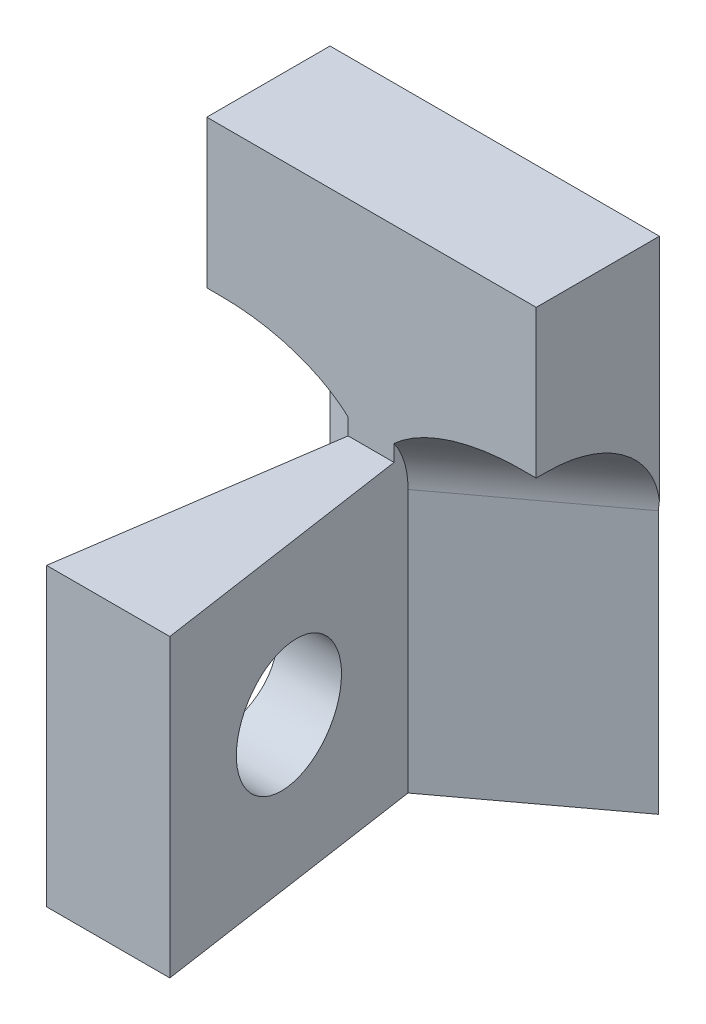
ISO-10303-21;
HEADER;
FILE_DESCRIPTION(('STEP AP214'),'2;1');
FILE_NAME('part.step','',(''),(''),'','','');
FILE_SCHEMA(('AUTOMOTIVE_DESIGN { 1 0 10303 214 1 1 1 1 }'));
ENDSEC;
DATA;
#1=APPLICATION_CONTEXT('core data for automotive mechanical design processes');
#2=APPLICATION_PROTOCOL_DEFINITION('international standard','automotive_design',2000,#1);
#3=PRODUCT_CONTEXT('',#1,'mechanical');
#4=PRODUCT('Part','Part','',(#3));
#5=PRODUCT_RELATED_PRODUCT_CATEGORY('part','',(#4));
#6=PRODUCT_DEFINITION_FORMATION('','',#4);
#7=PRODUCT_DEFINITION_CONTEXT('part definition',#1,'design');
#8=PRODUCT_DEFINITION('design','',#6,#7);
#9=PRODUCT_DEFINITION_SHAPE('','',#8);
#10=(LENGTH_UNIT() NAMED_UNIT(*) SI_UNIT(.MILLI.,.METRE.));
#11=(NAMED_UNIT(*) PLANE_ANGLE_UNIT() SI_UNIT($,.RADIAN.));
#12=(NAMED_UNIT(*) SI_UNIT($,.STERADIAN.) SOLID_ANGLE_UNIT());
#13=UNCERTAINTY_MEASURE_WITH_UNIT(LENGTH_MEASURE(1.E-05),#10,'distance_accuracy_value','');
#14=(GEOMETRIC_REPRESENTATION_CONTEXT(3) GLOBAL_UNCERTAINTY_ASSIGNED_CONTEXT((#13)) GLOBAL_UNIT_ASSIGNED_CONTEXT((#10,
#11,#12)) REPRESENTATION_CONTEXT('',''));
#15=CARTESIAN_POINT('',(0.,0.,0.));
#16=DIRECTION('',(0.,0.,1.));
#17=DIRECTION('',(1.,0.,0.));
#18=AXIS2_PLACEMENT_3D('',#15,#16,#17);
#19=CARTESIAN_POINT('',(19.4117647058824,36.,-47.));
#20=DIRECTION('',(0.,-1.,0.));
#21=DIRECTION('',(0.,0.,-1.));
#22=AXIS2_PLACEMENT_3D('',#19,#20,#21);
#23=PLANE('',#22);
#24=DIRECTION('',(1.,0.,0.));
#25=VECTOR('',#24,1.);
#26=CARTESIAN_POINT('',(22.7941176470588,36.,-32.));
#27=LINE('',#26,#25);
#28=CARTESIAN_POINT('',(17.2058823529412,36.,-32.));
#29=VERTEX_POINT('',#28);
#30=CARTESIAN_POINT('',(22.7941176470588,36.,-32.));
#31=VERTEX_POINT('',#30);
#32=EDGE_CURVE('E153',#29,#31,#27,.T.);
#33=ORIENTED_EDGE('',*,*,#32,.F.);
#34=DIRECTION('',(-0.145493990494831,0.,0.989359135364853));
#35=VECTOR('',#34,1.);
#36=CARTESIAN_POINT('',(12.5,36.,0.));
#37=LINE('',#36,#35);
#38=CARTESIAN_POINT('',(12.5,36.,0.));
#39=VERTEX_POINT('',#38);
#40=EDGE_CURVE('E221',#29,#39,#37,.T.);
#41=ORIENTED_EDGE('',*,*,#40,.T.);
#42=DIRECTION('',(1.,0.,0.));
#43=VECTOR('',#42,1.);
#44=CARTESIAN_POINT('',(27.5,36.,0.));
#45=LINE('',#44,#43);
#46=CARTESIAN_POINT('',(27.5,36.,0.));
#47=VERTEX_POINT('',#46);
#48=EDGE_CURVE('E244',#39,#47,#45,.T.);
#49=ORIENTED_EDGE('',*,*,#48,.T.);
#50=DIRECTION('',(-0.145493990494831,0.,-0.989359135364853));
#51=VECTOR('',#50,1.);
#52=CARTESIAN_POINT('',(27.5,36.,0.));
#53=LINE('',#52,#51);
#54=EDGE_CURVE('E185',#47,#31,#53,.T.);
#55=ORIENTED_EDGE('',*,*,#54,.T.);
#56=EDGE_LOOP('',(#33,#41,#49,#55));
#57=FACE_BOUND('',#56,.T.);
#58=ADVANCED_FACE('F34',(#57),#23,.F.);
#59=CARTESIAN_POINT('',(12.5,36.,0.));
#60=DIRECTION('',(0.989359135364853,0.,0.145493990494831));
#61=DIRECTION('',(0.145493990494831,0.,-0.989359135364853));
#62=AXIS2_PLACEMENT_3D('',#59,#60,#61);
#63=PLANE('',#62);
#64=DIRECTION('',(0.,-1.,0.));
#65=VECTOR('',#64,1.);
#66=CARTESIAN_POINT('',(17.2058823529412,43.,-32.));
#67=LINE('',#66,#65);
#68=CARTESIAN_POINT('',(17.2058823529412,38.0006477236576,-32.));
#69=VERTEX_POINT('',#68);
#70=EDGE_CURVE('E190',#69,#29,#67,.T.);
#71=ORIENTED_EDGE('',*,*,#70,.F.);
#72=CARTESIAN_POINT('',(15.683314220284,32.,-21.6465366979314));
#73=DIRECTION('',(0.989359135364853,0.,0.145493990494831));
#74=DIRECTION('',(0.145493990494831,0.,-0.989359135364853));
#75=AXIS2_PLACEMENT_3D('',#72,#73,#74);
#76=ELLIPSE('',#75,12.4863286348621,11.);
#77=CARTESIAN_POINT('',(17.5,32.,-34.));
#78=VERTEX_POINT('',#77);
#79=EDGE_CURVE('E199',#69,#78,#76,.F.);
#80=ORIENTED_EDGE('',*,*,#79,.T.);
#81=DIRECTION('',(0.,-1.,0.));
#82=VECTOR('',#81,1.);
#83=CARTESIAN_POINT('',(17.5,36.,-34.));
#84=LINE('',#83,#82);
#85=CARTESIAN_POINT('',(17.5,0.,-34.));
#86=VERTEX_POINT('',#85);
#87=EDGE_CURVE('E229',#78,#86,#84,.T.);
#88=ORIENTED_EDGE('',*,*,#87,.T.);
#89=DIRECTION('',(-0.145493990494831,0.,0.989359135364853));
#90=VECTOR('',#89,1.);
#91=CARTESIAN_POINT('',(12.5,0.,0.));
#92=LINE('',#91,#90);
#93=CARTESIAN_POINT('',(12.5,0.,0.));
#94=VERTEX_POINT('',#93);
#95=EDGE_CURVE('E254',#86,#94,#92,.T.);
#96=ORIENTED_EDGE('',*,*,#95,.T.);
#97=DIRECTION('',(0.,-1.,0.));
#98=VECTOR('',#97,1.);
#99=CARTESIAN_POINT('',(12.5,36.,0.));
#100=LINE('',#99,#98);
#101=EDGE_CURVE('E236',#39,#94,#100,.T.);
#102=ORIENTED_EDGE('',*,*,#101,.F.);
#103=ORIENTED_EDGE('',*,*,#40,.F.);
#104=EDGE_LOOP('',(#71,#80,#88,#96,#102,#103));
#105=FACE_BOUND('',#104,.T.);
#106=CARTESIAN_POINT('',(15.,18.,-17.));
#107=DIRECTION('',(0.989359135364853,0.,0.145493990494831));
#108=DIRECTION('',(-0.145493990494831,0.,0.989359135364853));
#109=AXIS2_PLACEMENT_3D('',#106,#107,#108);
#110=ELLIPSE('',#109,7.58066482828217,7.5);
#111=CARTESIAN_POINT('',(13.8970588235294,18.,-9.50000000000001));
#112=VERTEX_POINT('',#111);
#113=EDGE_CURVE('E242',#112,#112,#110,.F.);
#114=ORIENTED_EDGE('',*,*,#113,.F.);
#115=EDGE_LOOP('',(#114));
#116=FACE_BOUND('',#115,.T.);
#117=ADVANCED_FACE('F217',(#105,#116),#63,.F.);
#118=CARTESIAN_POINT('',(27.5,36.,0.));
#119=DIRECTION('',(-0.989359135364853,0.,0.145493990494831));
#120=DIRECTION('',(0.145493990494831,0.,0.989359135364853));
#121=AXIS2_PLACEMENT_3D('',#118,#119,#120);
#122=PLANE('',#121);
#123=DIRECTION('',(0.,-1.,0.));
#124=VECTOR('',#123,1.);
#125=CARTESIAN_POINT('',(22.5,36.,-34.));
#126=LINE('',#125,#124);
#127=CARTESIAN_POINT('',(22.5,32.,-34.));
#128=VERTEX_POINT('',#127);
#129=CARTESIAN_POINT('',(22.5,0.,-34.));
#130=VERTEX_POINT('',#129);
#131=EDGE_CURVE('E184',#128,#130,#126,.T.);
#132=ORIENTED_EDGE('',*,*,#131,.F.);
#133=CARTESIAN_POINT('',(24.316685779716,32.,-21.6465366979314));
#134=DIRECTION('',(-0.989359135364853,0.,0.145493990494831));
#135=DIRECTION('',(0.145493990494831,0.,0.989359135364853));
#136=AXIS2_PLACEMENT_3D('',#133,#134,#135);
#137=ELLIPSE('',#136,12.4863286348621,11.);
#138=CARTESIAN_POINT('',(22.7941176470588,38.0006477236576,-32.));
#139=VERTEX_POINT('',#138);
#140=EDGE_CURVE('E187',#128,#139,#137,.F.);
#141=ORIENTED_EDGE('',*,*,#140,.T.);
#142=DIRECTION('',(0.,-1.,0.));
#143=VECTOR('',#142,1.);
#144=CARTESIAN_POINT('',(22.7941176470588,43.,-32.));
#145=LINE('',#144,#143);
#146=EDGE_CURVE('E155',#139,#31,#145,.T.);
#147=ORIENTED_EDGE('',*,*,#146,.T.);
#148=ORIENTED_EDGE('',*,*,#54,.F.);
#149=DIRECTION('',(0.,-1.,0.));
#150=VECTOR('',#149,1.);
#151=CARTESIAN_POINT('',(27.5,36.,0.));
#152=LINE('',#151,#150);
#153=CARTESIAN_POINT('',(27.5,0.,0.));
#154=VERTEX_POINT('',#153);
#155=EDGE_CURVE('E264',#47,#154,#152,.T.);
#156=ORIENTED_EDGE('',*,*,#155,.T.);
#157=DIRECTION('',(-0.145493990494831,0.,-0.989359135364853));
#158=VECTOR('',#157,1.);
#159=CARTESIAN_POINT('',(27.5,0.,0.));
#160=LINE('',#159,#158);
#161=EDGE_CURVE('E258',#154,#130,#160,.T.);
#162=ORIENTED_EDGE('',*,*,#161,.T.);
#163=EDGE_LOOP('',(#132,#141,#147,#148,#156,#162));
#164=FACE_BOUND('',#163,.T.);
#165=CARTESIAN_POINT('',(25.,18.,-17.));
#166=DIRECTION('',(-0.989359135364853,0.,0.145493990494831));
#167=DIRECTION('',(-0.145493990494831,0.,-0.989359135364853));
#168=AXIS2_PLACEMENT_3D('',#165,#166,#167);
#169=ELLIPSE('',#168,7.58066482828217,7.5);
#170=CARTESIAN_POINT('',(23.8970588235294,18.,-24.5));
#171=VERTEX_POINT('',#170);
#172=EDGE_CURVE('E197',#171,#171,#169,.F.);
#173=ORIENTED_EDGE('',*,*,#172,.F.);
#174=EDGE_LOOP('',(#173));
#175=FACE_BOUND('',#174,.T.);
#176=ADVANCED_FACE('F279',(#164,#175),#122,.F.);
#177=CARTESIAN_POINT('',(40.,36.,-47.));
#178=DIRECTION('',(0.,0.,1.));
#179=DIRECTION('',(1.,0.,0.));
#180=AXIS2_PLACEMENT_3D('',#177,#178,#179);
#181=PLANE('',#180);
#182=DIRECTION('',(-1.,0.,0.));
#183=VECTOR('',#182,1.);
#184=CARTESIAN_POINT('',(40.,0.,-47.));
#185=LINE('',#184,#183);
#186=CARTESIAN_POINT('',(40.,0.,-47.));
#187=VERTEX_POINT('',#186);
#188=CARTESIAN_POINT('',(0.,0.,-47.));
#189=VERTEX_POINT('',#188);
#190=EDGE_CURVE('E234',#187,#189,#185,.T.);
#191=ORIENTED_EDGE('',*,*,#190,.T.);
#192=DIRECTION('',(0.,-1.,0.));
#193=VECTOR('',#192,1.);
#194=CARTESIAN_POINT('',(0.,36.,-47.));
#195=LINE('',#194,#193);
#196=CARTESIAN_POINT('',(0.,32.,-47.));
#197=VERTEX_POINT('',#196);
#198=EDGE_CURVE('E181',#197,#189,#195,.T.);
#199=ORIENTED_EDGE('',*,*,#198,.F.);
#200=DIRECTION('',(0.,-1.,0.));
#201=VECTOR('',#200,1.);
#202=CARTESIAN_POINT('',(0.,61.,-47.));
#203=LINE('',#202,#201);
#204=CARTESIAN_POINT('',(0.,61.,-47.));
#205=VERTEX_POINT('',#204);
#206=EDGE_CURVE('E232',#205,#197,#203,.T.);
#207=ORIENTED_EDGE('',*,*,#206,.F.);
#208=DIRECTION('',(-1.,0.,0.));
#209=VECTOR('',#208,1.);
#210=CARTESIAN_POINT('',(0.,61.,-47.));
#211=LINE('',#210,#209);
#212=CARTESIAN_POINT('',(40.0985604754172,61.,-47.));
#213=VERTEX_POINT('',#212);
#214=EDGE_CURVE('E144',#213,#205,#211,.T.);
#215=ORIENTED_EDGE('',*,*,#214,.F.);
#216=DIRECTION('',(0.,-1.,0.));
#217=VECTOR('',#216,1.);
#218=CARTESIAN_POINT('',(40.0985604754172,61.,-47.));
#219=LINE('',#218,#217);
#220=CARTESIAN_POINT('',(40.0985604754172,33.1355937280815,-47.));
#221=VERTEX_POINT('',#220);
#222=EDGE_CURVE('E49',#213,#221,#219,.T.);
#223=ORIENTED_EDGE('',*,*,#222,.T.);
#224=CARTESIAN_POINT('',(58.446347917116,32.,-47.));
#225=DIRECTION('',(0.,0.,1.));
#226=DIRECTION('',(-1.,0.,0.));
#227=AXIS2_PLACEMENT_3D('',#224,#225,#226);
#228=ELLIPSE('',#227,18.446347917116,11.);
#229=CARTESIAN_POINT('',(40.,32.,-47.));
#230=VERTEX_POINT('',#229);
#231=EDGE_CURVE('E206',#221,#230,#228,.T.);
#232=ORIENTED_EDGE('',*,*,#231,.T.);
#233=DIRECTION('',(0.,-1.,0.));
#234=VECTOR('',#233,1.);
#235=CARTESIAN_POINT('',(40.,36.,-47.));
#236=LINE('',#235,#234);
#237=EDGE_CURVE('E182',#230,#187,#236,.T.);
#238=ORIENTED_EDGE('',*,*,#237,.T.);
#239=EDGE_LOOP('',(#191,#199,#207,#215,#223,#232,#238));
#240=FACE_BOUND('',#239,.T.);
#241=ADVANCED_FACE('F231',(#240),#181,.F.);
#242=CARTESIAN_POINT('',(0.,36.,-47.));
#243=DIRECTION('',(0.596324001337593,0.,-0.802743847954453));
#244=DIRECTION('',(-0.802743847954453,0.,-0.596324001337593));
#245=AXIS2_PLACEMENT_3D('',#242,#243,#244);
#246=PLANE('',#245);
#247=ORIENTED_EDGE('',*,*,#87,.F.);
#248=DIRECTION('',(0.802743847954453,0.,0.596324001337593));
#249=VECTOR('',#248,1.);
#250=CARTESIAN_POINT('',(0.,32.,-47.));
#251=LINE('',#250,#249);
#252=EDGE_CURVE('E201',#78,#197,#251,.F.);
#253=ORIENTED_EDGE('',*,*,#252,.T.);
#254=ORIENTED_EDGE('',*,*,#198,.T.);
#255=DIRECTION('',(0.802743847954453,0.,0.596324001337593));
#256=VECTOR('',#255,1.);
#257=CARTESIAN_POINT('',(0.,0.,-47.));
#258=LINE('',#257,#256);
#259=EDGE_CURVE('E252',#189,#86,#258,.T.);
#260=ORIENTED_EDGE('',*,*,#259,.T.);
#261=EDGE_LOOP('',(#247,#253,#254,#260));
#262=FACE_BOUND('',#261,.T.);
#263=ADVANCED_FACE('F226',(#262),#246,.F.);
#264=CARTESIAN_POINT('',(27.5,36.,0.));
#265=DIRECTION('',(0.,0.,-1.));
#266=DIRECTION('',(-1.,0.,0.));
#267=AXIS2_PLACEMENT_3D('',#264,#265,#266);
#268=PLANE('',#267);
#269=DIRECTION('',(1.,0.,0.));
#270=VECTOR('',#269,1.);
#271=CARTESIAN_POINT('',(27.5,0.,0.));
#272=LINE('',#271,#270);
#273=EDGE_CURVE('E256',#94,#154,#272,.T.);
#274=ORIENTED_EDGE('',*,*,#273,.T.);
#275=ORIENTED_EDGE('',*,*,#155,.F.);
#276=ORIENTED_EDGE('',*,*,#48,.F.);
#277=ORIENTED_EDGE('',*,*,#101,.T.);
#278=EDGE_LOOP('',(#274,#275,#276,#277));
#279=FACE_BOUND('',#278,.T.);
#280=ADVANCED_FACE('F270',(#279),#268,.F.);
#281=CARTESIAN_POINT('',(22.5,36.,-34.));
#282=DIRECTION('',(-0.596324001337593,0.,-0.802743847954453));
#283=DIRECTION('',(-0.802743847954453,0.,0.596324001337593));
#284=AXIS2_PLACEMENT_3D('',#281,#282,#283);
#285=PLANE('',#284);
#286=ORIENTED_EDGE('',*,*,#237,.F.);
#287=DIRECTION('',(0.802743847954453,0.,-0.596324001337593));
#288=VECTOR('',#287,1.);
#289=CARTESIAN_POINT('',(22.5,32.,-34.));
#290=LINE('',#289,#288);
#291=EDGE_CURVE('E180',#230,#128,#290,.F.);
#292=ORIENTED_EDGE('',*,*,#291,.T.);
#293=ORIENTED_EDGE('',*,*,#131,.T.);
#294=DIRECTION('',(0.802743847954453,0.,-0.596324001337593));
#295=VECTOR('',#294,1.);
#296=CARTESIAN_POINT('',(22.5,0.,-34.));
#297=LINE('',#296,#295);
#298=EDGE_CURVE('E245',#130,#187,#297,.T.);
#299=ORIENTED_EDGE('',*,*,#298,.T.);
#300=EDGE_LOOP('',(#286,#292,#293,#299));
#301=FACE_BOUND('',#300,.T.);
#302=ADVANCED_FACE('F322',(#301),#285,.F.);
#303=CARTESIAN_POINT('',(19.4117647058824,0.,-47.));
#304=DIRECTION('',(0.,-1.,0.));
#305=DIRECTION('',(0.,0.,-1.));
#306=AXIS2_PLACEMENT_3D('',#303,#304,#305);
#307=PLANE('',#306);
#308=ORIENTED_EDGE('',*,*,#190,.F.);
#309=ORIENTED_EDGE('',*,*,#298,.F.);
#310=ORIENTED_EDGE('',*,*,#161,.F.);
#311=ORIENTED_EDGE('',*,*,#273,.F.);
#312=ORIENTED_EDGE('',*,*,#95,.F.);
#313=ORIENTED_EDGE('',*,*,#259,.F.);
#314=EDGE_LOOP('',(#308,#309,#310,#311,#312,#313));
#315=FACE_BOUND('',#314,.T.);
#316=ADVANCED_FACE('F275',(#315),#307,.T.);
#317=CARTESIAN_POINT('',(40.,18.,-17.));
#318=DIRECTION('',(-1.,0.,0.));
#319=DIRECTION('',(0.,0.,1.));
#320=AXIS2_PLACEMENT_3D('',#317,#318,#319);
#321=CYLINDRICAL_SURFACE('',#320,7.5);
#322=ORIENTED_EDGE('',*,*,#172,.T.);
#323=EDGE_LOOP('',(#322));
#324=FACE_BOUND('',#323,.T.);
#325=ORIENTED_EDGE('',*,*,#113,.T.);
#326=EDGE_LOOP('',(#325));
#327=FACE_BOUND('',#326,.T.);
#328=ADVANCED_FACE('F308',(#324,#327),#321,.F.);
#329=CARTESIAN_POINT('',(22.7941176470588,43.,-32.));
#330=DIRECTION('',(0.,0.,-1.));
#331=DIRECTION('',(-1.,0.,0.));
#332=AXIS2_PLACEMENT_3D('',#329,#330,#331);
#333=PLANE('',#332);
#334=ORIENTED_EDGE('',*,*,#32,.T.);
#335=ORIENTED_EDGE('',*,*,#146,.F.);
#336=CARTESIAN_POINT('',(38.2540402248083,32.,-32.));
#337=DIRECTION('',(0.,0.,-1.));
#338=DIRECTION('',(-1.,0.,0.));
#339=AXIS2_PLACEMENT_3D('',#336,#337,#338);
#340=ELLIPSE('',#339,18.446347917116,11.);
#341=CARTESIAN_POINT('',(38.2540402248083,43.,-32.));
#342=VERTEX_POINT('',#341);
#343=EDGE_CURVE('E208',#139,#342,#340,.T.);
#344=ORIENTED_EDGE('',*,*,#343,.T.);
#345=DIRECTION('',(1.,0.,0.));
#346=VECTOR('',#345,1.);
#347=CARTESIAN_POINT('',(0.,43.,-32.));
#348=LINE('',#347,#346);
#349=CARTESIAN_POINT('',(40.0985604754172,43.,-32.));
#350=VERTEX_POINT('',#349);
#351=EDGE_CURVE('E163',#342,#350,#348,.T.);
#352=ORIENTED_EDGE('',*,*,#351,.T.);
#353=DIRECTION('',(0.,-1.,0.));
#354=VECTOR('',#353,1.);
#355=CARTESIAN_POINT('',(40.0985604754172,61.,-32.));
#356=LINE('',#355,#354);
#357=CARTESIAN_POINT('',(40.0985604754172,61.,-32.));
#358=VERTEX_POINT('',#357);
#359=EDGE_CURVE('E136',#358,#350,#356,.T.);
#360=ORIENTED_EDGE('',*,*,#359,.F.);
#361=DIRECTION('',(1.,0.,0.));
#362=VECTOR('',#361,1.);
#363=CARTESIAN_POINT('',(0.,61.,-32.));
#364=LINE('',#363,#362);
#365=CARTESIAN_POINT('',(0.,61.,-32.));
#366=VERTEX_POINT('',#365);
#367=EDGE_CURVE('E128',#366,#358,#364,.T.);
#368=ORIENTED_EDGE('',*,*,#367,.F.);
#369=DIRECTION('',(0.,-1.,0.));
#370=VECTOR('',#369,1.);
#371=CARTESIAN_POINT('',(0.,61.,-32.));
#372=LINE('',#371,#370);
#373=CARTESIAN_POINT('',(0.,43.,-32.));
#374=VERTEX_POINT('',#373);
#375=EDGE_CURVE('E134',#366,#374,#372,.T.);
#376=ORIENTED_EDGE('',*,*,#375,.T.);
#377=CARTESIAN_POINT('',(1.7459597751917,43.,-32.));
#378=VERTEX_POINT('',#377);
#379=EDGE_CURVE('E160',#374,#378,#348,.T.);
#380=ORIENTED_EDGE('',*,*,#379,.T.);
#381=CARTESIAN_POINT('',(1.7459597751917,32.,-32.));
#382=DIRECTION('',(0.,0.,-1.));
#383=DIRECTION('',(-1.,0.,0.));
#384=AXIS2_PLACEMENT_3D('',#381,#382,#383);
#385=ELLIPSE('',#384,18.446347917116,11.);
#386=EDGE_CURVE('E43',#378,#69,#385,.T.);
#387=ORIENTED_EDGE('',*,*,#386,.T.);
#388=ORIENTED_EDGE('',*,*,#70,.T.);
#389=EDGE_LOOP('',(#334,#335,#344,#352,#360,#368,#376,#380,#387,#388));
#390=FACE_BOUND('',#389,.T.);
#391=ADVANCED_FACE('F131',(#390),#333,.F.);
#392=CARTESIAN_POINT('',(0.,43.,-32.));
#393=DIRECTION('',(0.,1.,0.));
#394=DIRECTION('',(0.,0.,1.));
#395=AXIS2_PLACEMENT_3D('',#392,#393,#394);
#396=PLANE('',#395);
#397=DIRECTION('',(0.,0.,1.));
#398=VECTOR('',#397,1.);
#399=CARTESIAN_POINT('',(0.,43.,-47.));
#400=LINE('',#399,#398);
#401=CARTESIAN_POINT('',(0.,43.,-33.2969986901424));
#402=VERTEX_POINT('',#401);
#403=EDGE_CURVE('E151',#402,#374,#400,.T.);
#404=ORIENTED_EDGE('',*,*,#403,.F.);
#405=DIRECTION('',(0.802743847954453,0.,0.596324001337593));
#406=VECTOR('',#405,1.);
#407=CARTESIAN_POINT('',(10.9404359852865,43.,-25.169817672501));
#408=LINE('',#407,#406);
#409=EDGE_CURVE('E198',#402,#378,#408,.T.);
#410=ORIENTED_EDGE('',*,*,#409,.T.);
#411=ORIENTED_EDGE('',*,*,#379,.F.);
#412=EDGE_LOOP('',(#404,#410,#411));
#413=FACE_BOUND('',#412,.T.);
#414=ADVANCED_FACE('F301',(#413),#396,.F.);
#415=ORIENTED_EDGE('',*,*,#351,.F.);
#416=DIRECTION('',(0.802743847954453,0.,-0.596324001337593));
#417=VECTOR('',#416,1.);
#418=CARTESIAN_POINT('',(46.5595640147135,43.,-38.169817672501));
#419=LINE('',#418,#417);
#420=CARTESIAN_POINT('',(40.0985604754172,43.,-33.3702150433095));
#421=VERTEX_POINT('',#420);
#422=EDGE_CURVE('E177',#342,#421,#419,.T.);
#423=ORIENTED_EDGE('',*,*,#422,.T.);
#424=DIRECTION('',(0.,0.,-1.));
#425=VECTOR('',#424,1.);
#426=CARTESIAN_POINT('',(40.0985604754172,43.,-47.));
#427=LINE('',#426,#425);
#428=EDGE_CURVE('E147',#350,#421,#427,.T.);
#429=ORIENTED_EDGE('',*,*,#428,.F.);
#430=EDGE_LOOP('',(#415,#423,#429));
#431=FACE_BOUND('',#430,.T.);
#432=ADVANCED_FACE('F296',(#431),#396,.F.);
#433=CARTESIAN_POINT('',(0.,61.,-47.));
#434=DIRECTION('',(1.,0.,0.));
#435=DIRECTION('',(0.,0.,-1.));
#436=AXIS2_PLACEMENT_3D('',#433,#434,#435);
#437=PLANE('',#436);
#438=ORIENTED_EDGE('',*,*,#206,.T.);
#439=CARTESIAN_POINT('',(0.,32.,-33.2969986901424));
#440=DIRECTION('',(1.,0.,0.));
#441=DIRECTION('',(0.,0.,-1.));
#442=AXIS2_PLACEMENT_3D('',#439,#440,#441);
#443=ELLIPSE('',#442,13.7030013098576,11.);
#444=EDGE_CURVE('E11',#197,#402,#443,.T.);
#445=ORIENTED_EDGE('',*,*,#444,.T.);
#446=ORIENTED_EDGE('',*,*,#403,.T.);
#447=ORIENTED_EDGE('',*,*,#375,.F.);
#448=DIRECTION('',(0.,0.,1.));
#449=VECTOR('',#448,1.);
#450=CARTESIAN_POINT('',(0.,61.,-47.));
#451=LINE('',#450,#449);
#452=EDGE_CURVE('E140',#205,#366,#451,.T.);
#453=ORIENTED_EDGE('',*,*,#452,.F.);
#454=EDGE_LOOP('',(#438,#445,#446,#447,#453));
#455=FACE_BOUND('',#454,.T.);
#456=ADVANCED_FACE('F149',(#455),#437,.F.);
#457=CARTESIAN_POINT('',(40.0985604754172,61.,-47.));
#458=DIRECTION('',(-1.,0.,0.));
#459=DIRECTION('',(0.,0.,1.));
#460=AXIS2_PLACEMENT_3D('',#457,#458,#459);
#461=PLANE('',#460);
#462=ORIENTED_EDGE('',*,*,#428,.T.);
#463=CARTESIAN_POINT('',(40.0985604754172,32.,-33.3702150433095));
#464=DIRECTION('',(-1.,0.,0.));
#465=DIRECTION('',(0.,0.,1.));
#466=AXIS2_PLACEMENT_3D('',#463,#464,#465);
#467=ELLIPSE('',#466,13.7030013098576,11.);
#468=EDGE_CURVE('E204',#421,#221,#467,.T.);
#469=ORIENTED_EDGE('',*,*,#468,.T.);
#470=ORIENTED_EDGE('',*,*,#222,.F.);
#471=DIRECTION('',(0.,0.,-1.));
#472=VECTOR('',#471,1.);
#473=CARTESIAN_POINT('',(40.0985604754172,61.,-47.));
#474=LINE('',#473,#472);
#475=EDGE_CURVE('E139',#358,#213,#474,.T.);
#476=ORIENTED_EDGE('',*,*,#475,.F.);
#477=ORIENTED_EDGE('',*,*,#359,.T.);
#478=EDGE_LOOP('',(#462,#469,#470,#476,#477));
#479=FACE_BOUND('',#478,.T.);
#480=ADVANCED_FACE('F298',(#479),#461,.F.);
#481=CARTESIAN_POINT('',(0.,61.,-32.));
#482=DIRECTION('',(0.,1.,0.));
#483=DIRECTION('',(0.,0.,1.));
#484=AXIS2_PLACEMENT_3D('',#481,#482,#483);
#485=PLANE('',#484);
#486=ORIENTED_EDGE('',*,*,#452,.T.);
#487=ORIENTED_EDGE('',*,*,#367,.T.);
#488=ORIENTED_EDGE('',*,*,#475,.T.);
#489=ORIENTED_EDGE('',*,*,#214,.T.);
#490=EDGE_LOOP('',(#486,#487,#488,#489));
#491=FACE_BOUND('',#490,.T.);
#492=ADVANCED_FACE('F143',(#491),#485,.T.);
#493=CARTESIAN_POINT('',(13.6032252456446,32.,-13.6879660154784));
#494=DIRECTION('',(-0.802743847954453,0.,0.596324001337593));
#495=DIRECTION('',(0.596324001337593,0.,0.802743847954453));
#496=AXIS2_PLACEMENT_3D('',#493,#494,#495);
#497=CYLINDRICAL_SURFACE('',#496,11.);
#498=ORIENTED_EDGE('',*,*,#140,.F.);
#499=ORIENTED_EDGE('',*,*,#291,.F.);
#500=ORIENTED_EDGE('',*,*,#231,.F.);
#501=ORIENTED_EDGE('',*,*,#468,.F.);
#502=ORIENTED_EDGE('',*,*,#422,.F.);
#503=ORIENTED_EDGE('',*,*,#343,.F.);
#504=EDGE_LOOP('',(#498,#499,#500,#501,#502,#503));
#505=FACE_BOUND('',#504,.T.);
#506=ADVANCED_FACE('F290',(#505),#497,.F.);
#507=CARTESIAN_POINT('',(0.620867337206518,32.,-32.8357829539319));
#508=DIRECTION('',(-0.802743847954453,0.,-0.596324001337593));
#509=DIRECTION('',(-0.596324001337593,0.,0.802743847954453));
#510=AXIS2_PLACEMENT_3D('',#507,#508,#509);
#511=CYLINDRICAL_SURFACE('',#510,11.);
#512=ORIENTED_EDGE('',*,*,#444,.F.);
#513=ORIENTED_EDGE('',*,*,#252,.F.);
#514=ORIENTED_EDGE('',*,*,#79,.F.);
#515=ORIENTED_EDGE('',*,*,#386,.F.);
#516=ORIENTED_EDGE('',*,*,#409,.F.);
#517=EDGE_LOOP('',(#512,#513,#514,#515,#516));
#518=FACE_BOUND('',#517,.T.);
#519=ADVANCED_FACE('F36',(#518),#511,.F.);
#520=CLOSED_SHELL('',(#58,#117,#176,#241,#263,#280,#302,#316,#328,#391,#414,#432,#456,#480,#492,
#506,#519));
#521=MANIFOLD_SOLID_BREP('B2',#520);
#522=ADVANCED_BREP_SHAPE_REPRESENTATION('',(#18,#521),#14);
#523=SHAPE_DEFINITION_REPRESENTATION(#9,#522);
ENDSEC;
END-ISO-10303-21;
